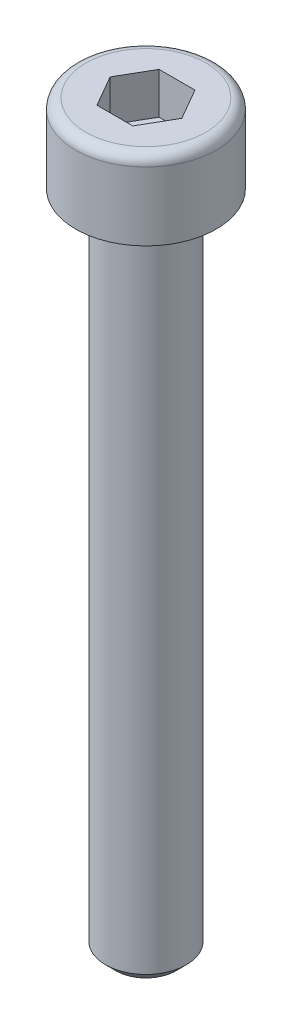
ISO-10303-21;
HEADER;
FILE_DESCRIPTION(('STEP AP214'),'2;1');
FILE_NAME('part.step','',(''),(''),'','','');
FILE_SCHEMA(('AUTOMOTIVE_DESIGN { 1 0 10303 214 1 1 1 1 }'));
ENDSEC;
DATA;
#1=APPLICATION_CONTEXT('core data for automotive mechanical design processes');
#2=APPLICATION_PROTOCOL_DEFINITION('international standard','automotive_design',2000,#1);
#3=PRODUCT_CONTEXT('',#1,'mechanical');
#4=PRODUCT('Part','Part','',(#3));
#5=PRODUCT_RELATED_PRODUCT_CATEGORY('part','',(#4));
#6=PRODUCT_DEFINITION_FORMATION('','',#4);
#7=PRODUCT_DEFINITION_CONTEXT('part definition',#1,'design');
#8=PRODUCT_DEFINITION('design','',#6,#7);
#9=PRODUCT_DEFINITION_SHAPE('','',#8);
#10=(LENGTH_UNIT() NAMED_UNIT(*) SI_UNIT(.MILLI.,.METRE.));
#11=(NAMED_UNIT(*) PLANE_ANGLE_UNIT() SI_UNIT($,.RADIAN.));
#12=(NAMED_UNIT(*) SI_UNIT($,.STERADIAN.) SOLID_ANGLE_UNIT());
#13=UNCERTAINTY_MEASURE_WITH_UNIT(LENGTH_MEASURE(1.E-05),#10,'distance_accuracy_value','');
#14=(GEOMETRIC_REPRESENTATION_CONTEXT(3) GLOBAL_UNCERTAINTY_ASSIGNED_CONTEXT((#13)) GLOBAL_UNIT_ASSIGNED_CONTEXT((#10,
#11,#12)) REPRESENTATION_CONTEXT('',''));
#15=CARTESIAN_POINT('',(0.,0.,0.));
#16=DIRECTION('',(0.,0.,1.));
#17=DIRECTION('',(1.,0.,0.));
#18=AXIS2_PLACEMENT_3D('',#15,#16,#17);
#19=CARTESIAN_POINT('',(0.,3.8,0.));
#20=DIRECTION('',(0.,1.,0.));
#21=DIRECTION('',(-1.,0.,0.));
#22=AXIS2_PLACEMENT_3D('',#19,#20,#21);
#23=PLANE('',#22);
#24=DIRECTION('',(0.5,0.,-0.866025403784439));
#25=VECTOR('',#24,1.);
#26=CARTESIAN_POINT('',(0.866025403784438,3.8,1.5));
#27=LINE('',#26,#25);
#28=CARTESIAN_POINT('',(0.866025403784438,3.8,1.5));
#29=VERTEX_POINT('',#28);
#30=CARTESIAN_POINT('',(1.73205080756888,3.8,0.));
#31=VERTEX_POINT('',#30);
#32=EDGE_CURVE('E44',#29,#31,#27,.T.);
#33=ORIENTED_EDGE('',*,*,#32,.F.);
#34=DIRECTION('',(1.,0.,0.));
#35=VECTOR('',#34,1.);
#36=CARTESIAN_POINT('',(-0.86602540378444,3.8,1.5));
#37=LINE('',#36,#35);
#38=CARTESIAN_POINT('',(-0.86602540378444,3.8,1.5));
#39=VERTEX_POINT('',#38);
#40=EDGE_CURVE('E127',#39,#29,#37,.T.);
#41=ORIENTED_EDGE('',*,*,#40,.F.);
#42=DIRECTION('',(0.5,0.,0.866025403784439));
#43=VECTOR('',#42,1.);
#44=CARTESIAN_POINT('',(-1.73205080756888,3.8,0.));
#45=LINE('',#44,#43);
#46=CARTESIAN_POINT('',(-1.73205080756888,3.8,0.));
#47=VERTEX_POINT('',#46);
#48=EDGE_CURVE('E125',#47,#39,#45,.T.);
#49=ORIENTED_EDGE('',*,*,#48,.F.);
#50=DIRECTION('',(-0.5,0.,0.866025403784439));
#51=VECTOR('',#50,1.);
#52=CARTESIAN_POINT('',(-0.866025403784439,3.8,-1.5));
#53=LINE('',#52,#51);
#54=CARTESIAN_POINT('',(-0.866025403784439,3.8,-1.5));
#55=VERTEX_POINT('',#54);
#56=EDGE_CURVE('E92',#55,#47,#53,.T.);
#57=ORIENTED_EDGE('',*,*,#56,.F.);
#58=DIRECTION('',(-1.,0.,0.));
#59=VECTOR('',#58,1.);
#60=CARTESIAN_POINT('',(0.866025403784439,3.8,-1.5));
#61=LINE('',#60,#59);
#62=CARTESIAN_POINT('',(0.866025403784439,3.8,-1.5));
#63=VERTEX_POINT('',#62);
#64=EDGE_CURVE('E121',#63,#55,#61,.T.);
#65=ORIENTED_EDGE('',*,*,#64,.F.);
#66=DIRECTION('',(-0.5,0.,-0.866025403784439));
#67=VECTOR('',#66,1.);
#68=CARTESIAN_POINT('',(1.73205080756888,3.8,0.));
#69=LINE('',#68,#67);
#70=EDGE_CURVE('E118',#31,#63,#69,.T.);
#71=ORIENTED_EDGE('',*,*,#70,.F.);
#72=EDGE_LOOP('',(#33,#41,#49,#57,#65,#71));
#73=FACE_BOUND('',#72,.T.);
#74=CARTESIAN_POINT('',(0.,3.8,0.));
#75=DIRECTION('',(0.,1.,0.));
#76=DIRECTION('',(-1.,0.,0.));
#77=AXIS2_PLACEMENT_3D('',#74,#75,#76);
#78=CIRCLE('',#77,2.9);
#79=CARTESIAN_POINT('',(-2.9,3.8,0.));
#80=VERTEX_POINT('',#79);
#81=EDGE_CURVE('E11',#80,#80,#78,.T.);
#82=ORIENTED_EDGE('',*,*,#81,.T.);
#83=EDGE_LOOP('',(#82));
#84=FACE_BOUND('',#83,.T.);
#85=ADVANCED_FACE('F30',(#73,#84),#23,.T.);
#86=CARTESIAN_POINT('',(0.,3.3,0.));
#87=DIRECTION('',(0.,1.,0.));
#88=DIRECTION('',(-1.,0.,0.));
#89=AXIS2_PLACEMENT_3D('',#86,#87,#88);
#90=TOROIDAL_SURFACE('',#89,2.9,0.5);
#91=CARTESIAN_POINT('',(0.,3.3,0.));
#92=DIRECTION('',(0.,1.,0.));
#93=DIRECTION('',(-1.,0.,0.));
#94=AXIS2_PLACEMENT_3D('',#91,#92,#93);
#95=CIRCLE('',#94,3.4);
#96=CARTESIAN_POINT('',(-3.4,3.3,0.));
#97=VERTEX_POINT('',#96);
#98=EDGE_CURVE('E37',#97,#97,#95,.T.);
#99=ORIENTED_EDGE('',*,*,#98,.T.);
#100=EDGE_LOOP('',(#99));
#101=FACE_BOUND('',#100,.T.);
#102=ORIENTED_EDGE('',*,*,#81,.F.);
#103=EDGE_LOOP('',(#102));
#104=FACE_BOUND('',#103,.T.);
#105=ADVANCED_FACE('F150',(#101,#104),#90,.T.);
#106=CARTESIAN_POINT('',(0.,3.8,0.));
#107=DIRECTION('',(0.,1.,0.));
#108=DIRECTION('',(-1.,0.,0.));
#109=AXIS2_PLACEMENT_3D('',#106,#107,#108);
#110=CYLINDRICAL_SURFACE('',#109,3.4);
#111=CARTESIAN_POINT('',(0.,0.,0.));
#112=DIRECTION('',(0.,1.,0.));
#113=DIRECTION('',(-1.,0.,0.));
#114=AXIS2_PLACEMENT_3D('',#111,#112,#113);
#115=CIRCLE('',#114,3.4);
#116=CARTESIAN_POINT('',(-3.4,0.,0.));
#117=VERTEX_POINT('',#116);
#118=EDGE_CURVE('E145',#117,#117,#115,.T.);
#119=ORIENTED_EDGE('',*,*,#118,.T.);
#120=EDGE_LOOP('',(#119));
#121=FACE_BOUND('',#120,.T.);
#122=ORIENTED_EDGE('',*,*,#98,.F.);
#123=EDGE_LOOP('',(#122));
#124=FACE_BOUND('',#123,.T.);
#125=ADVANCED_FACE('F153',(#121,#124),#110,.T.);
#126=CARTESIAN_POINT('',(-3.4,0.,0.));
#127=DIRECTION('',(0.,-1.,0.));
#128=DIRECTION('',(1.,0.,0.));
#129=AXIS2_PLACEMENT_3D('',#126,#127,#128);
#130=PLANE('',#129);
#131=CARTESIAN_POINT('',(0.,0.,0.));
#132=DIRECTION('',(0.,1.,0.));
#133=DIRECTION('',(-1.,0.,0.));
#134=AXIS2_PLACEMENT_3D('',#131,#132,#133);
#135=CIRCLE('',#134,1.95);
#136=CARTESIAN_POINT('',(-1.95,0.,0.));
#137=VERTEX_POINT('',#136);
#138=EDGE_CURVE('E142',#137,#137,#135,.T.);
#139=ORIENTED_EDGE('',*,*,#138,.T.);
#140=EDGE_LOOP('',(#139));
#141=FACE_BOUND('',#140,.T.);
#142=ORIENTED_EDGE('',*,*,#118,.F.);
#143=EDGE_LOOP('',(#142));
#144=FACE_BOUND('',#143,.T.);
#145=ADVANCED_FACE('F155',(#141,#144),#130,.T.);
#146=CARTESIAN_POINT('',(0.,3.8,0.));
#147=DIRECTION('',(0.,1.,0.));
#148=DIRECTION('',(-1.,0.,0.));
#149=AXIS2_PLACEMENT_3D('',#146,#147,#148);
#150=CYLINDRICAL_SURFACE('',#149,1.95);
#151=CARTESIAN_POINT('',(0.,-31.5,0.));
#152=DIRECTION('',(0.,1.,0.));
#153=DIRECTION('',(-1.,0.,0.));
#154=AXIS2_PLACEMENT_3D('',#151,#152,#153);
#155=CIRCLE('',#154,1.95);
#156=CARTESIAN_POINT('',(-1.95,-31.5,0.));
#157=VERTEX_POINT('',#156);
#158=EDGE_CURVE('E139',#157,#157,#155,.T.);
#159=ORIENTED_EDGE('',*,*,#158,.T.);
#160=EDGE_LOOP('',(#159));
#161=FACE_BOUND('',#160,.T.);
#162=ORIENTED_EDGE('',*,*,#138,.F.);
#163=EDGE_LOOP('',(#162));
#164=FACE_BOUND('',#163,.T.);
#165=ADVANCED_FACE('F162',(#161,#164),#150,.T.);
#166=CARTESIAN_POINT('',(0.,-31.5,0.));
#167=DIRECTION('',(0.,1.,0.));
#168=DIRECTION('',(-1.,0.,0.));
#169=AXIS2_PLACEMENT_3D('',#166,#167,#168);
#170=CONICAL_SURFACE('',#169,1.95,0.785398163397448);
#171=CARTESIAN_POINT('',(0.,-32.,0.));
#172=DIRECTION('',(0.,1.,0.));
#173=DIRECTION('',(-1.,0.,0.));
#174=AXIS2_PLACEMENT_3D('',#171,#172,#173);
#175=CIRCLE('',#174,1.45);
#176=CARTESIAN_POINT('',(-1.45,-32.,0.));
#177=VERTEX_POINT('',#176);
#178=EDGE_CURVE('E131',#177,#177,#175,.T.);
#179=ORIENTED_EDGE('',*,*,#178,.T.);
#180=EDGE_LOOP('',(#179));
#181=FACE_BOUND('',#180,.T.);
#182=ORIENTED_EDGE('',*,*,#158,.F.);
#183=EDGE_LOOP('',(#182));
#184=FACE_BOUND('',#183,.T.);
#185=ADVANCED_FACE('F187',(#181,#184),#170,.T.);
#186=CARTESIAN_POINT('',(-1.45,-32.,0.));
#187=DIRECTION('',(0.,-1.,0.));
#188=DIRECTION('',(1.,0.,0.));
#189=AXIS2_PLACEMENT_3D('',#186,#187,#188);
#190=PLANE('',#189);
#191=ORIENTED_EDGE('',*,*,#178,.F.);
#192=EDGE_LOOP('',(#191));
#193=FACE_BOUND('',#192,.T.);
#194=ADVANCED_FACE('F180',(#193),#190,.T.);
#195=CARTESIAN_POINT('',(0.866025403784438,1.8,1.5));
#196=DIRECTION('',(0.866025403784439,0.,0.5));
#197=DIRECTION('',(0.5,0.,-0.866025403784439));
#198=AXIS2_PLACEMENT_3D('',#195,#196,#197);
#199=PLANE('',#198);
#200=ORIENTED_EDGE('',*,*,#32,.T.);
#201=DIRECTION('',(0.,1.,0.));
#202=VECTOR('',#201,1.);
#203=CARTESIAN_POINT('',(1.73205080756888,1.8,0.));
#204=LINE('',#203,#202);
#205=CARTESIAN_POINT('',(1.73205080756888,1.8,0.));
#206=VERTEX_POINT('',#205);
#207=EDGE_CURVE('E74',#206,#31,#204,.T.);
#208=ORIENTED_EDGE('',*,*,#207,.F.);
#209=DIRECTION('',(0.5,0.,-0.866025403784439));
#210=VECTOR('',#209,1.);
#211=CARTESIAN_POINT('',(0.866025403784438,1.8,1.5));
#212=LINE('',#211,#210);
#213=CARTESIAN_POINT('',(0.866025403784438,1.8,1.5));
#214=VERTEX_POINT('',#213);
#215=EDGE_CURVE('E129',#214,#206,#212,.T.);
#216=ORIENTED_EDGE('',*,*,#215,.F.);
#217=DIRECTION('',(0.,1.,0.));
#218=VECTOR('',#217,1.);
#219=CARTESIAN_POINT('',(0.866025403784438,1.8,1.5));
#220=LINE('',#219,#218);
#221=EDGE_CURVE('E52',#214,#29,#220,.T.);
#222=ORIENTED_EDGE('',*,*,#221,.T.);
#223=EDGE_LOOP('',(#200,#208,#216,#222));
#224=FACE_BOUND('',#223,.T.);
#225=ADVANCED_FACE('F177',(#224),#199,.F.);
#226=CARTESIAN_POINT('',(-0.86602540378444,1.8,1.5));
#227=DIRECTION('',(0.,0.,1.));
#228=DIRECTION('',(1.,0.,0.));
#229=AXIS2_PLACEMENT_3D('',#226,#227,#228);
#230=PLANE('',#229);
#231=ORIENTED_EDGE('',*,*,#40,.T.);
#232=ORIENTED_EDGE('',*,*,#221,.F.);
#233=DIRECTION('',(1.,0.,0.));
#234=VECTOR('',#233,1.);
#235=CARTESIAN_POINT('',(-0.86602540378444,1.8,1.5));
#236=LINE('',#235,#234);
#237=CARTESIAN_POINT('',(-0.86602540378444,1.8,1.5));
#238=VERTEX_POINT('',#237);
#239=EDGE_CURVE('E104',#238,#214,#236,.T.);
#240=ORIENTED_EDGE('',*,*,#239,.F.);
#241=DIRECTION('',(0.,1.,0.));
#242=VECTOR('',#241,1.);
#243=CARTESIAN_POINT('',(-0.86602540378444,1.8,1.5));
#244=LINE('',#243,#242);
#245=EDGE_CURVE('E96',#238,#39,#244,.T.);
#246=ORIENTED_EDGE('',*,*,#245,.T.);
#247=EDGE_LOOP('',(#231,#232,#240,#246));
#248=FACE_BOUND('',#247,.T.);
#249=ADVANCED_FACE('F179',(#248),#230,.F.);
#250=CARTESIAN_POINT('',(-1.73205080756888,1.8,0.));
#251=DIRECTION('',(-0.866025403784439,0.,0.5));
#252=DIRECTION('',(0.5,0.,0.866025403784439));
#253=AXIS2_PLACEMENT_3D('',#250,#251,#252);
#254=PLANE('',#253);
#255=ORIENTED_EDGE('',*,*,#48,.T.);
#256=ORIENTED_EDGE('',*,*,#245,.F.);
#257=DIRECTION('',(0.5,0.,0.866025403784439));
#258=VECTOR('',#257,1.);
#259=CARTESIAN_POINT('',(-1.73205080756888,1.8,0.));
#260=LINE('',#259,#258);
#261=CARTESIAN_POINT('',(-1.73205080756888,1.8,0.));
#262=VERTEX_POINT('',#261);
#263=EDGE_CURVE('E100',#262,#238,#260,.T.);
#264=ORIENTED_EDGE('',*,*,#263,.F.);
#265=DIRECTION('',(0.,1.,0.));
#266=VECTOR('',#265,1.);
#267=CARTESIAN_POINT('',(-1.73205080756888,1.8,0.));
#268=LINE('',#267,#266);
#269=EDGE_CURVE('E85',#262,#47,#268,.T.);
#270=ORIENTED_EDGE('',*,*,#269,.T.);
#271=EDGE_LOOP('',(#255,#256,#264,#270));
#272=FACE_BOUND('',#271,.T.);
#273=ADVANCED_FACE('F101',(#272),#254,.F.);
#274=CARTESIAN_POINT('',(-0.866025403784438,1.8,-1.5));
#275=DIRECTION('',(-0.866025403784439,0.,-0.5));
#276=DIRECTION('',(-0.5,0.,0.866025403784439));
#277=AXIS2_PLACEMENT_3D('',#274,#275,#276);
#278=PLANE('',#277);
#279=ORIENTED_EDGE('',*,*,#56,.T.);
#280=ORIENTED_EDGE('',*,*,#269,.F.);
#281=DIRECTION('',(-0.5,0.,0.866025403784439));
#282=VECTOR('',#281,1.);
#283=CARTESIAN_POINT('',(-0.866025403784438,1.8,-1.5));
#284=LINE('',#283,#282);
#285=CARTESIAN_POINT('',(-0.866025403784438,1.8,-1.5));
#286=VERTEX_POINT('',#285);
#287=EDGE_CURVE('E89',#286,#262,#284,.T.);
#288=ORIENTED_EDGE('',*,*,#287,.F.);
#289=DIRECTION('',(0.,1.,0.));
#290=VECTOR('',#289,1.);
#291=CARTESIAN_POINT('',(-0.866025403784438,1.8,-1.5));
#292=LINE('',#291,#290);
#293=EDGE_CURVE('E97',#286,#55,#292,.T.);
#294=ORIENTED_EDGE('',*,*,#293,.T.);
#295=EDGE_LOOP('',(#279,#280,#288,#294));
#296=FACE_BOUND('',#295,.T.);
#297=ADVANCED_FACE('F87',(#296),#278,.F.);
#298=CARTESIAN_POINT('',(0.866025403784439,1.8,-1.5));
#299=DIRECTION('',(0.,0.,-1.));
#300=DIRECTION('',(-1.,0.,0.));
#301=AXIS2_PLACEMENT_3D('',#298,#299,#300);
#302=PLANE('',#301);
#303=ORIENTED_EDGE('',*,*,#64,.T.);
#304=ORIENTED_EDGE('',*,*,#293,.F.);
#305=DIRECTION('',(-1.,0.,0.));
#306=VECTOR('',#305,1.);
#307=CARTESIAN_POINT('',(0.866025403784439,1.8,-1.5));
#308=LINE('',#307,#306);
#309=CARTESIAN_POINT('',(0.866025403784439,1.8,-1.5));
#310=VERTEX_POINT('',#309);
#311=EDGE_CURVE('E110',#310,#286,#308,.T.);
#312=ORIENTED_EDGE('',*,*,#311,.F.);
#313=DIRECTION('',(0.,1.,0.));
#314=VECTOR('',#313,1.);
#315=CARTESIAN_POINT('',(0.866025403784439,1.8,-1.5));
#316=LINE('',#315,#314);
#317=EDGE_CURVE('E134',#310,#63,#316,.T.);
#318=ORIENTED_EDGE('',*,*,#317,.T.);
#319=EDGE_LOOP('',(#303,#304,#312,#318));
#320=FACE_BOUND('',#319,.T.);
#321=ADVANCED_FACE('F248',(#320),#302,.F.);
#322=CARTESIAN_POINT('',(1.73205080756888,1.8,0.));
#323=DIRECTION('',(0.866025403784439,0.,-0.5));
#324=DIRECTION('',(-0.5,0.,-0.866025403784439));
#325=AXIS2_PLACEMENT_3D('',#322,#323,#324);
#326=PLANE('',#325);
#327=ORIENTED_EDGE('',*,*,#70,.T.);
#328=ORIENTED_EDGE('',*,*,#317,.F.);
#329=DIRECTION('',(-0.5,0.,-0.866025403784439));
#330=VECTOR('',#329,1.);
#331=CARTESIAN_POINT('',(1.73205080756888,1.8,0.));
#332=LINE('',#331,#330);
#333=EDGE_CURVE('E112',#206,#310,#332,.T.);
#334=ORIENTED_EDGE('',*,*,#333,.F.);
#335=ORIENTED_EDGE('',*,*,#207,.T.);
#336=EDGE_LOOP('',(#327,#328,#334,#335));
#337=FACE_BOUND('',#336,.T.);
#338=ADVANCED_FACE('F175',(#337),#326,.F.);
#339=CARTESIAN_POINT('',(2.59807621135332,1.8,-1.5));
#340=DIRECTION('',(0.,1.,0.));
#341=DIRECTION('',(0.,0.,1.));
#342=AXIS2_PLACEMENT_3D('',#339,#340,#341);
#343=PLANE('',#342);
#344=ORIENTED_EDGE('',*,*,#215,.T.);
#345=ORIENTED_EDGE('',*,*,#333,.T.);
#346=ORIENTED_EDGE('',*,*,#311,.T.);
#347=ORIENTED_EDGE('',*,*,#287,.T.);
#348=ORIENTED_EDGE('',*,*,#263,.T.);
#349=ORIENTED_EDGE('',*,*,#239,.T.);
#350=EDGE_LOOP('',(#344,#345,#346,#347,#348,#349));
#351=FACE_BOUND('',#350,.T.);
#352=ADVANCED_FACE('F107',(#351),#343,.T.);
#353=CLOSED_SHELL('',(#85,#105,#125,#145,#165,#185,#194,#225,#249,#273,#297,#321,#338,#352));
#354=MANIFOLD_SOLID_BREP('B2',#353);
#355=ADVANCED_BREP_SHAPE_REPRESENTATION('',(#18,#354),#14);
#356=SHAPE_DEFINITION_REPRESENTATION(#9,#355);
ENDSEC;
END-ISO-10303-21;
